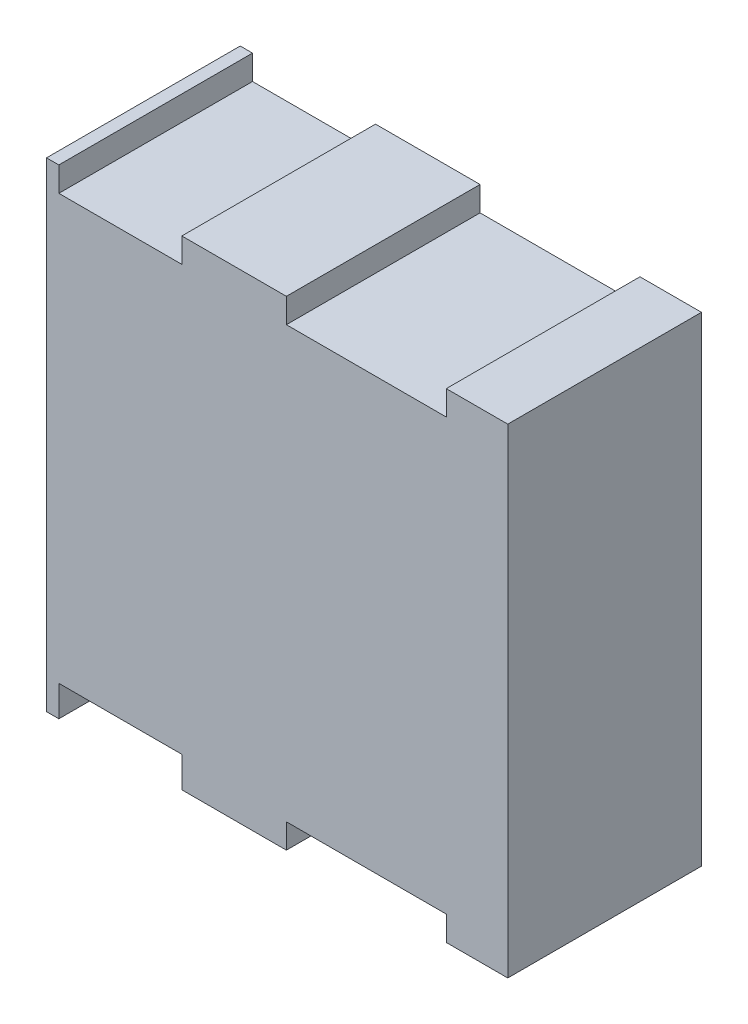
ISO-10303-21;
HEADER;
FILE_DESCRIPTION(('STEP AP214'),'2;1');
FILE_NAME('part.step','',(''),(''),'','','');
FILE_SCHEMA(('AUTOMOTIVE_DESIGN { 1 0 10303 214 1 1 1 1 }'));
ENDSEC;
DATA;
#1=APPLICATION_CONTEXT('core data for automotive mechanical design processes');
#2=APPLICATION_PROTOCOL_DEFINITION('international standard','automotive_design',2000,#1);
#3=PRODUCT_CONTEXT('',#1,'mechanical');
#4=PRODUCT('Part','Part','',(#3));
#5=PRODUCT_RELATED_PRODUCT_CATEGORY('part','',(#4));
#6=PRODUCT_DEFINITION_FORMATION('','',#4);
#7=PRODUCT_DEFINITION_CONTEXT('part definition',#1,'design');
#8=PRODUCT_DEFINITION('design','',#6,#7);
#9=PRODUCT_DEFINITION_SHAPE('','',#8);
#10=(LENGTH_UNIT() NAMED_UNIT(*) SI_UNIT(.MILLI.,.METRE.));
#11=(NAMED_UNIT(*) PLANE_ANGLE_UNIT() SI_UNIT($,.RADIAN.));
#12=(NAMED_UNIT(*) SI_UNIT($,.STERADIAN.) SOLID_ANGLE_UNIT());
#13=UNCERTAINTY_MEASURE_WITH_UNIT(LENGTH_MEASURE(1.E-05),#10,'distance_accuracy_value','');
#14=(GEOMETRIC_REPRESENTATION_CONTEXT(3) GLOBAL_UNCERTAINTY_ASSIGNED_CONTEXT((#13)) GLOBAL_UNIT_ASSIGNED_CONTEXT((#10,
#11,#12)) REPRESENTATION_CONTEXT('',''));
#15=CARTESIAN_POINT('',(0.,0.,0.));
#16=DIRECTION('',(0.,0.,1.));
#17=DIRECTION('',(1.,0.,0.));
#18=AXIS2_PLACEMENT_3D('',#15,#16,#17);
#19=CARTESIAN_POINT('',(-4.5085,-4.953,0.));
#20=DIRECTION('',(-1.,0.,0.));
#21=DIRECTION('',(0.,0.,1.));
#22=AXIS2_PLACEMENT_3D('',#19,#20,#21);
#23=PLANE('',#22);
#24=DIRECTION('',(0.,0.,1.));
#25=VECTOR('',#24,1.);
#26=CARTESIAN_POINT('',(-4.5085,-4.318,0.));
#27=LINE('',#26,#25);
#28=CARTESIAN_POINT('',(-4.5085,-4.318,0.));
#29=VERTEX_POINT('',#28);
#30=CARTESIAN_POINT('',(-4.5085,-4.318,4.));
#31=VERTEX_POINT('',#30);
#32=EDGE_CURVE('E202',#29,#31,#27,.T.);
#33=ORIENTED_EDGE('',*,*,#32,.T.);
#34=DIRECTION('',(0.,1.,0.));
#35=VECTOR('',#34,1.);
#36=CARTESIAN_POINT('',(-4.5085,-4.318,4.));
#37=LINE('',#36,#35);
#38=CARTESIAN_POINT('',(-4.5085,-4.953,4.));
#39=VERTEX_POINT('',#38);
#40=EDGE_CURVE('E204',#39,#31,#37,.T.);
#41=ORIENTED_EDGE('',*,*,#40,.F.);
#42=DIRECTION('',(0.,0.,1.));
#43=VECTOR('',#42,1.);
#44=CARTESIAN_POINT('',(-4.5085,-4.953,0.));
#45=LINE('',#44,#43);
#46=CARTESIAN_POINT('',(-4.5085,-4.953,0.));
#47=VERTEX_POINT('',#46);
#48=EDGE_CURVE('E198',#39,#47,#45,.F.);
#49=ORIENTED_EDGE('',*,*,#48,.T.);
#50=DIRECTION('',(0.,1.,0.));
#51=VECTOR('',#50,1.);
#52=CARTESIAN_POINT('',(-4.5085,-4.953,0.));
#53=LINE('',#52,#51);
#54=EDGE_CURVE('E20',#29,#47,#53,.F.);
#55=ORIENTED_EDGE('',*,*,#54,.F.);
#56=EDGE_LOOP('',(#33,#41,#49,#55));
#57=FACE_BOUND('',#56,.T.);
#58=ADVANCED_FACE('F17',(#57),#23,.F.);
#59=CARTESIAN_POINT('',(-1.9685,-4.318,0.));
#60=DIRECTION('',(1.,0.,0.));
#61=DIRECTION('',(0.,0.,-1.));
#62=AXIS2_PLACEMENT_3D('',#59,#60,#61);
#63=PLANE('',#62);
#64=DIRECTION('',(0.,0.,1.));
#65=VECTOR('',#64,1.);
#66=CARTESIAN_POINT('',(-1.9685,-4.953,0.));
#67=LINE('',#66,#65);
#68=CARTESIAN_POINT('',(-1.9685,-4.953,0.));
#69=VERTEX_POINT('',#68);
#70=CARTESIAN_POINT('',(-1.9685,-4.953,4.));
#71=VERTEX_POINT('',#70);
#72=EDGE_CURVE('E290',#69,#71,#67,.T.);
#73=ORIENTED_EDGE('',*,*,#72,.T.);
#74=DIRECTION('',(0.,1.,0.));
#75=VECTOR('',#74,1.);
#76=CARTESIAN_POINT('',(-1.9685,-4.318,4.));
#77=LINE('',#76,#75);
#78=CARTESIAN_POINT('',(-1.9685,-4.318,4.));
#79=VERTEX_POINT('',#78);
#80=EDGE_CURVE('E228',#79,#71,#77,.F.);
#81=ORIENTED_EDGE('',*,*,#80,.F.);
#82=DIRECTION('',(0.,0.,1.));
#83=VECTOR('',#82,1.);
#84=CARTESIAN_POINT('',(-1.9685,-4.318,0.));
#85=LINE('',#84,#83);
#86=CARTESIAN_POINT('',(-1.9685,-4.318,0.));
#87=VERTEX_POINT('',#86);
#88=EDGE_CURVE('E293',#79,#87,#85,.F.);
#89=ORIENTED_EDGE('',*,*,#88,.T.);
#90=DIRECTION('',(0.,1.,0.));
#91=VECTOR('',#90,1.);
#92=CARTESIAN_POINT('',(-1.9685,-4.318,0.));
#93=LINE('',#92,#91);
#94=EDGE_CURVE('E185',#69,#87,#93,.T.);
#95=ORIENTED_EDGE('',*,*,#94,.F.);
#96=EDGE_LOOP('',(#73,#81,#89,#95));
#97=FACE_BOUND('',#96,.T.);
#98=ADVANCED_FACE('F526',(#97),#63,.F.);
#99=CARTESIAN_POINT('',(0.1905,-4.953,0.));
#100=DIRECTION('',(-1.,0.,0.));
#101=DIRECTION('',(0.,0.,1.));
#102=AXIS2_PLACEMENT_3D('',#99,#100,#101);
#103=PLANE('',#102);
#104=DIRECTION('',(0.,0.,1.));
#105=VECTOR('',#104,1.);
#106=CARTESIAN_POINT('',(0.1905,-4.445,0.));
#107=LINE('',#106,#105);
#108=CARTESIAN_POINT('',(0.1905,-4.445,0.));
#109=VERTEX_POINT('',#108);
#110=CARTESIAN_POINT('',(0.1905,-4.445,4.));
#111=VERTEX_POINT('',#110);
#112=EDGE_CURVE('E281',#109,#111,#107,.T.);
#113=ORIENTED_EDGE('',*,*,#112,.T.);
#114=DIRECTION('',(0.,1.,0.));
#115=VECTOR('',#114,1.);
#116=CARTESIAN_POINT('',(0.1905,-4.318,4.));
#117=LINE('',#116,#115);
#118=CARTESIAN_POINT('',(0.1905,-4.953,4.));
#119=VERTEX_POINT('',#118);
#120=EDGE_CURVE('E226',#119,#111,#117,.T.);
#121=ORIENTED_EDGE('',*,*,#120,.F.);
#122=DIRECTION('',(0.,0.,1.));
#123=VECTOR('',#122,1.);
#124=CARTESIAN_POINT('',(0.1905,-4.953,0.));
#125=LINE('',#124,#123);
#126=CARTESIAN_POINT('',(0.1905,-4.953,0.));
#127=VERTEX_POINT('',#126);
#128=EDGE_CURVE('E284',#119,#127,#125,.F.);
#129=ORIENTED_EDGE('',*,*,#128,.T.);
#130=DIRECTION('',(0.,1.,0.));
#131=VECTOR('',#130,1.);
#132=CARTESIAN_POINT('',(0.1905,-4.953,0.));
#133=LINE('',#132,#131);
#134=EDGE_CURVE('E167',#109,#127,#133,.F.);
#135=ORIENTED_EDGE('',*,*,#134,.F.);
#136=EDGE_LOOP('',(#113,#121,#129,#135));
#137=FACE_BOUND('',#136,.T.);
#138=ADVANCED_FACE('F358',(#137),#103,.F.);
#139=CARTESIAN_POINT('',(3.4925,-4.445,0.));
#140=DIRECTION('',(1.,0.,0.));
#141=DIRECTION('',(0.,0.,-1.));
#142=AXIS2_PLACEMENT_3D('',#139,#140,#141);
#143=PLANE('',#142);
#144=DIRECTION('',(0.,0.,1.));
#145=VECTOR('',#144,1.);
#146=CARTESIAN_POINT('',(3.4925,-4.953,0.));
#147=LINE('',#146,#145);
#148=CARTESIAN_POINT('',(3.4925,-4.953,0.));
#149=VERTEX_POINT('',#148);
#150=CARTESIAN_POINT('',(3.4925,-4.953,4.));
#151=VERTEX_POINT('',#150);
#152=EDGE_CURVE('E160',#149,#151,#147,.T.);
#153=ORIENTED_EDGE('',*,*,#152,.T.);
#154=DIRECTION('',(0.,1.,0.));
#155=VECTOR('',#154,1.);
#156=CARTESIAN_POINT('',(3.4925,-4.318,4.));
#157=LINE('',#156,#155);
#158=CARTESIAN_POINT('',(3.4925,-4.445,4.));
#159=VERTEX_POINT('',#158);
#160=EDGE_CURVE('E224',#159,#151,#157,.F.);
#161=ORIENTED_EDGE('',*,*,#160,.F.);
#162=DIRECTION('',(0.,0.,1.));
#163=VECTOR('',#162,1.);
#164=CARTESIAN_POINT('',(3.4925,-4.445,0.));
#165=LINE('',#164,#163);
#166=CARTESIAN_POINT('',(3.4925,-4.445,0.));
#167=VERTEX_POINT('',#166);
#168=EDGE_CURVE('E163',#159,#167,#165,.F.);
#169=ORIENTED_EDGE('',*,*,#168,.T.);
#170=DIRECTION('',(0.,1.,0.));
#171=VECTOR('',#170,1.);
#172=CARTESIAN_POINT('',(3.4925,-4.445,0.));
#173=LINE('',#172,#171);
#174=EDGE_CURVE('E157',#149,#167,#173,.T.);
#175=ORIENTED_EDGE('',*,*,#174,.F.);
#176=EDGE_LOOP('',(#153,#161,#169,#175));
#177=FACE_BOUND('',#176,.T.);
#178=ADVANCED_FACE('F159',(#177),#143,.F.);
#179=CARTESIAN_POINT('',(3.4925,-4.953,0.));
#180=DIRECTION('',(0.,1.,0.));
#181=DIRECTION('',(0.,0.,1.));
#182=AXIS2_PLACEMENT_3D('',#179,#180,#181);
#183=PLANE('',#182);
#184=DIRECTION('',(0.,0.,1.));
#185=VECTOR('',#184,1.);
#186=CARTESIAN_POINT('',(4.7625,-4.953,0.));
#187=LINE('',#186,#185);
#188=CARTESIAN_POINT('',(4.7625,-4.953,0.));
#189=VERTEX_POINT('',#188);
#190=CARTESIAN_POINT('',(4.7625,-4.953,4.));
#191=VERTEX_POINT('',#190);
#192=EDGE_CURVE('E275',#189,#191,#187,.T.);
#193=ORIENTED_EDGE('',*,*,#192,.T.);
#194=DIRECTION('',(1.,0.,0.));
#195=VECTOR('',#194,1.);
#196=CARTESIAN_POINT('',(-4.5085,-4.953,4.));
#197=LINE('',#196,#195);
#198=EDGE_CURVE('E174',#151,#191,#197,.T.);
#199=ORIENTED_EDGE('',*,*,#198,.F.);
#200=ORIENTED_EDGE('',*,*,#152,.F.);
#201=DIRECTION('',(1.,0.,0.));
#202=VECTOR('',#201,1.);
#203=CARTESIAN_POINT('',(3.4925,-4.953,0.));
#204=LINE('',#203,#202);
#205=EDGE_CURVE('E172',#189,#149,#204,.F.);
#206=ORIENTED_EDGE('',*,*,#205,.F.);
#207=EDGE_LOOP('',(#193,#199,#200,#206));
#208=FACE_BOUND('',#207,.T.);
#209=ADVANCED_FACE('F171',(#208),#183,.F.);
#210=CARTESIAN_POINT('',(4.7625,4.953,0.));
#211=DIRECTION('',(0.,-1.,0.));
#212=DIRECTION('',(0.,0.,-1.));
#213=AXIS2_PLACEMENT_3D('',#210,#211,#212);
#214=PLANE('',#213);
#215=DIRECTION('',(0.,0.,-1.));
#216=VECTOR('',#215,1.);
#217=CARTESIAN_POINT('',(3.4925,4.953,0.));
#218=LINE('',#217,#216);
#219=CARTESIAN_POINT('',(3.4925,4.953,0.));
#220=VERTEX_POINT('',#219);
#221=CARTESIAN_POINT('',(3.4925,4.953,4.));
#222=VERTEX_POINT('',#221);
#223=EDGE_CURVE('E181',#220,#222,#218,.F.);
#224=ORIENTED_EDGE('',*,*,#223,.T.);
#225=DIRECTION('',(1.,0.,0.));
#226=VECTOR('',#225,1.);
#227=CARTESIAN_POINT('',(-4.5085,4.953,4.));
#228=LINE('',#227,#226);
#229=CARTESIAN_POINT('',(4.7625,4.953,4.));
#230=VERTEX_POINT('',#229);
#231=EDGE_CURVE('E221',#230,#222,#228,.F.);
#232=ORIENTED_EDGE('',*,*,#231,.F.);
#233=DIRECTION('',(0.,0.,1.));
#234=VECTOR('',#233,1.);
#235=CARTESIAN_POINT('',(4.7625,4.953,0.));
#236=LINE('',#235,#234);
#237=CARTESIAN_POINT('',(4.7625,4.953,0.));
#238=VERTEX_POINT('',#237);
#239=EDGE_CURVE('E268',#230,#238,#236,.F.);
#240=ORIENTED_EDGE('',*,*,#239,.T.);
#241=DIRECTION('',(1.,0.,0.));
#242=VECTOR('',#241,1.);
#243=CARTESIAN_POINT('',(4.7625,4.953,0.));
#244=LINE('',#243,#242);
#245=EDGE_CURVE('E151',#220,#238,#244,.T.);
#246=ORIENTED_EDGE('',*,*,#245,.F.);
#247=EDGE_LOOP('',(#224,#232,#240,#246));
#248=FACE_BOUND('',#247,.T.);
#249=ADVANCED_FACE('F245',(#248),#214,.F.);
#250=CARTESIAN_POINT('',(3.4925,4.953,0.));
#251=DIRECTION('',(1.,0.,0.));
#252=DIRECTION('',(0.,0.,-1.));
#253=AXIS2_PLACEMENT_3D('',#250,#251,#252);
#254=PLANE('',#253);
#255=DIRECTION('',(0.,0.,-1.));
#256=VECTOR('',#255,1.);
#257=CARTESIAN_POINT('',(3.4925,4.445,0.));
#258=LINE('',#257,#256);
#259=CARTESIAN_POINT('',(3.4925,4.445,0.));
#260=VERTEX_POINT('',#259);
#261=CARTESIAN_POINT('',(3.4925,4.445,4.));
#262=VERTEX_POINT('',#261);
#263=EDGE_CURVE('E251',#260,#262,#258,.F.);
#264=ORIENTED_EDGE('',*,*,#263,.T.);
#265=DIRECTION('',(0.,1.,0.));
#266=VECTOR('',#265,1.);
#267=CARTESIAN_POINT('',(3.4925,-4.318,4.));
#268=LINE('',#267,#266);
#269=EDGE_CURVE('E219',#222,#262,#268,.F.);
#270=ORIENTED_EDGE('',*,*,#269,.F.);
#271=ORIENTED_EDGE('',*,*,#223,.F.);
#272=DIRECTION('',(0.,1.,0.));
#273=VECTOR('',#272,1.);
#274=CARTESIAN_POINT('',(3.4925,4.953,0.));
#275=LINE('',#274,#273);
#276=EDGE_CURVE('E242',#260,#220,#275,.T.);
#277=ORIENTED_EDGE('',*,*,#276,.F.);
#278=EDGE_LOOP('',(#264,#270,#271,#277));
#279=FACE_BOUND('',#278,.T.);
#280=ADVANCED_FACE('F249',(#279),#254,.F.);
#281=CARTESIAN_POINT('',(0.1905,4.445,0.));
#282=DIRECTION('',(-1.,0.,0.));
#283=DIRECTION('',(0.,0.,1.));
#284=AXIS2_PLACEMENT_3D('',#281,#282,#283);
#285=PLANE('',#284);
#286=DIRECTION('',(0.,0.,-1.));
#287=VECTOR('',#286,1.);
#288=CARTESIAN_POINT('',(0.1905,4.953,0.));
#289=LINE('',#288,#287);
#290=CARTESIAN_POINT('',(0.1905,4.953,0.));
#291=VERTEX_POINT('',#290);
#292=CARTESIAN_POINT('',(0.1905,4.953,4.));
#293=VERTEX_POINT('',#292);
#294=EDGE_CURVE('E266',#291,#293,#289,.F.);
#295=ORIENTED_EDGE('',*,*,#294,.T.);
#296=DIRECTION('',(0.,1.,0.));
#297=VECTOR('',#296,1.);
#298=CARTESIAN_POINT('',(0.1905,-4.318,4.));
#299=LINE('',#298,#297);
#300=CARTESIAN_POINT('',(0.1905,4.445,4.));
#301=VERTEX_POINT('',#300);
#302=EDGE_CURVE('E217',#301,#293,#299,.T.);
#303=ORIENTED_EDGE('',*,*,#302,.F.);
#304=DIRECTION('',(0.,0.,-1.));
#305=VECTOR('',#304,1.);
#306=CARTESIAN_POINT('',(0.1905,4.445,0.));
#307=LINE('',#306,#305);
#308=CARTESIAN_POINT('',(0.1905,4.445,0.));
#309=VERTEX_POINT('',#308);
#310=EDGE_CURVE('E264',#301,#309,#307,.T.);
#311=ORIENTED_EDGE('',*,*,#310,.T.);
#312=DIRECTION('',(0.,1.,0.));
#313=VECTOR('',#312,1.);
#314=CARTESIAN_POINT('',(0.1905,4.445,0.));
#315=LINE('',#314,#313);
#316=EDGE_CURVE('E240',#291,#309,#315,.F.);
#317=ORIENTED_EDGE('',*,*,#316,.F.);
#318=EDGE_LOOP('',(#295,#303,#311,#317));
#319=FACE_BOUND('',#318,.T.);
#320=ADVANCED_FACE('F334',(#319),#285,.F.);
#321=CARTESIAN_POINT('',(-1.9685,4.953,0.));
#322=DIRECTION('',(1.,0.,0.));
#323=DIRECTION('',(0.,0.,-1.));
#324=AXIS2_PLACEMENT_3D('',#321,#322,#323);
#325=PLANE('',#324);
#326=DIRECTION('',(0.,0.,-1.));
#327=VECTOR('',#326,1.);
#328=CARTESIAN_POINT('',(-1.9685,4.445,0.));
#329=LINE('',#328,#327);
#330=CARTESIAN_POINT('',(-1.9685,4.445,0.));
#331=VERTEX_POINT('',#330);
#332=CARTESIAN_POINT('',(-1.9685,4.445,4.));
#333=VERTEX_POINT('',#332);
#334=EDGE_CURVE('E323',#331,#333,#329,.F.);
#335=ORIENTED_EDGE('',*,*,#334,.T.);
#336=DIRECTION('',(0.,1.,0.));
#337=VECTOR('',#336,1.);
#338=CARTESIAN_POINT('',(-1.9685,-4.318,4.));
#339=LINE('',#338,#337);
#340=CARTESIAN_POINT('',(-1.9685,4.953,4.));
#341=VERTEX_POINT('',#340);
#342=EDGE_CURVE('E215',#341,#333,#339,.F.);
#343=ORIENTED_EDGE('',*,*,#342,.F.);
#344=DIRECTION('',(0.,0.,-1.));
#345=VECTOR('',#344,1.);
#346=CARTESIAN_POINT('',(-1.9685,4.953,0.));
#347=LINE('',#346,#345);
#348=CARTESIAN_POINT('',(-1.9685,4.953,0.));
#349=VERTEX_POINT('',#348);
#350=EDGE_CURVE('E326',#341,#349,#347,.T.);
#351=ORIENTED_EDGE('',*,*,#350,.T.);
#352=DIRECTION('',(0.,1.,0.));
#353=VECTOR('',#352,1.);
#354=CARTESIAN_POINT('',(-1.9685,4.953,0.));
#355=LINE('',#354,#353);
#356=EDGE_CURVE('E238',#331,#349,#355,.T.);
#357=ORIENTED_EDGE('',*,*,#356,.F.);
#358=EDGE_LOOP('',(#335,#343,#351,#357));
#359=FACE_BOUND('',#358,.T.);
#360=ADVANCED_FACE('F474',(#359),#325,.F.);
#361=CARTESIAN_POINT('',(-4.5085,4.445,0.));
#362=DIRECTION('',(-1.,0.,0.));
#363=DIRECTION('',(0.,0.,1.));
#364=AXIS2_PLACEMENT_3D('',#361,#362,#363);
#365=PLANE('',#364);
#366=DIRECTION('',(0.,0.,-1.));
#367=VECTOR('',#366,1.);
#368=CARTESIAN_POINT('',(-4.5085,4.953,0.));
#369=LINE('',#368,#367);
#370=CARTESIAN_POINT('',(-4.5085,4.953,0.));
#371=VERTEX_POINT('',#370);
#372=CARTESIAN_POINT('',(-4.5085,4.953,4.));
#373=VERTEX_POINT('',#372);
#374=EDGE_CURVE('E233',#371,#373,#369,.F.);
#375=ORIENTED_EDGE('',*,*,#374,.T.);
#376=DIRECTION('',(0.,1.,0.));
#377=VECTOR('',#376,1.);
#378=CARTESIAN_POINT('',(-4.5085,-4.318,4.));
#379=LINE('',#378,#377);
#380=CARTESIAN_POINT('',(-4.5085,4.445,4.));
#381=VERTEX_POINT('',#380);
#382=EDGE_CURVE('E213',#381,#373,#379,.T.);
#383=ORIENTED_EDGE('',*,*,#382,.F.);
#384=DIRECTION('',(0.,0.,-1.));
#385=VECTOR('',#384,1.);
#386=CARTESIAN_POINT('',(-4.5085,4.445,0.));
#387=LINE('',#386,#385);
#388=CARTESIAN_POINT('',(-4.5085,4.445,0.));
#389=VERTEX_POINT('',#388);
#390=EDGE_CURVE('E317',#381,#389,#387,.T.);
#391=ORIENTED_EDGE('',*,*,#390,.T.);
#392=DIRECTION('',(0.,1.,0.));
#393=VECTOR('',#392,1.);
#394=CARTESIAN_POINT('',(-4.5085,4.445,0.));
#395=LINE('',#394,#393);
#396=EDGE_CURVE('E236',#371,#389,#395,.F.);
#397=ORIENTED_EDGE('',*,*,#396,.F.);
#398=EDGE_LOOP('',(#375,#383,#391,#397));
#399=FACE_BOUND('',#398,.T.);
#400=ADVANCED_FACE('F465',(#399),#365,.F.);
#401=CARTESIAN_POINT('',(-4.5085,4.953,0.));
#402=DIRECTION('',(0.,-1.,0.));
#403=DIRECTION('',(0.,0.,-1.));
#404=AXIS2_PLACEMENT_3D('',#401,#402,#403);
#405=PLANE('',#404);
#406=DIRECTION('',(0.,0.,-1.));
#407=VECTOR('',#406,1.);
#408=CARTESIAN_POINT('',(-4.7625,4.953,0.));
#409=LINE('',#408,#407);
#410=CARTESIAN_POINT('',(-4.7625,4.953,0.));
#411=VERTEX_POINT('',#410);
#412=CARTESIAN_POINT('',(-4.7625,4.953,4.));
#413=VERTEX_POINT('',#412);
#414=EDGE_CURVE('E312',#411,#413,#409,.F.);
#415=ORIENTED_EDGE('',*,*,#414,.T.);
#416=DIRECTION('',(1.,0.,0.));
#417=VECTOR('',#416,1.);
#418=CARTESIAN_POINT('',(-4.5085,4.953,4.));
#419=LINE('',#418,#417);
#420=EDGE_CURVE('E211',#373,#413,#419,.F.);
#421=ORIENTED_EDGE('',*,*,#420,.F.);
#422=ORIENTED_EDGE('',*,*,#374,.F.);
#423=DIRECTION('',(1.,0.,0.));
#424=VECTOR('',#423,1.);
#425=CARTESIAN_POINT('',(-4.5085,4.953,0.));
#426=LINE('',#425,#424);
#427=EDGE_CURVE('E230',#411,#371,#426,.T.);
#428=ORIENTED_EDGE('',*,*,#427,.F.);
#429=EDGE_LOOP('',(#415,#421,#422,#428));
#430=FACE_BOUND('',#429,.T.);
#431=ADVANCED_FACE('F457',(#430),#405,.F.);
#432=CARTESIAN_POINT('',(-4.5085,-4.318,4.));
#433=DIRECTION('',(0.,0.,1.));
#434=DIRECTION('',(1.,0.,0.));
#435=AXIS2_PLACEMENT_3D('',#432,#433,#434);
#436=PLANE('',#435);
#437=DIRECTION('',(1.,0.,0.));
#438=VECTOR('',#437,1.);
#439=CARTESIAN_POINT('',(-4.7625,-4.953,4.));
#440=LINE('',#439,#438);
#441=CARTESIAN_POINT('',(-4.7625,-4.953,4.));
#442=VERTEX_POINT('',#441);
#443=EDGE_CURVE('E205',#442,#39,#440,.T.);
#444=ORIENTED_EDGE('',*,*,#443,.T.);
#445=ORIENTED_EDGE('',*,*,#40,.T.);
#446=DIRECTION('',(1.,0.,0.));
#447=VECTOR('',#446,1.);
#448=CARTESIAN_POINT('',(-4.5085,-4.318,4.));
#449=LINE('',#448,#447);
#450=EDGE_CURVE('E295',#31,#79,#449,.T.);
#451=ORIENTED_EDGE('',*,*,#450,.T.);
#452=ORIENTED_EDGE('',*,*,#80,.T.);
#453=DIRECTION('',(1.,0.,0.));
#454=VECTOR('',#453,1.);
#455=CARTESIAN_POINT('',(-1.9685,-4.953,4.));
#456=LINE('',#455,#454);
#457=EDGE_CURVE('E287',#71,#119,#456,.T.);
#458=ORIENTED_EDGE('',*,*,#457,.T.);
#459=ORIENTED_EDGE('',*,*,#120,.T.);
#460=DIRECTION('',(1.,0.,0.));
#461=VECTOR('',#460,1.);
#462=CARTESIAN_POINT('',(0.1905,-4.445,4.));
#463=LINE('',#462,#461);
#464=EDGE_CURVE('E278',#111,#159,#463,.T.);
#465=ORIENTED_EDGE('',*,*,#464,.T.);
#466=ORIENTED_EDGE('',*,*,#160,.T.);
#467=ORIENTED_EDGE('',*,*,#198,.T.);
#468=DIRECTION('',(0.,1.,0.));
#469=VECTOR('',#468,1.);
#470=CARTESIAN_POINT('',(4.7625,-4.953,4.));
#471=LINE('',#470,#469);
#472=EDGE_CURVE('E273',#191,#230,#471,.T.);
#473=ORIENTED_EDGE('',*,*,#472,.T.);
#474=ORIENTED_EDGE('',*,*,#231,.T.);
#475=ORIENTED_EDGE('',*,*,#269,.T.);
#476=DIRECTION('',(1.,0.,0.));
#477=VECTOR('',#476,1.);
#478=CARTESIAN_POINT('',(3.4925,4.445,4.));
#479=LINE('',#478,#477);
#480=EDGE_CURVE('E256',#262,#301,#479,.F.);
#481=ORIENTED_EDGE('',*,*,#480,.T.);
#482=ORIENTED_EDGE('',*,*,#302,.T.);
#483=DIRECTION('',(1.,0.,0.));
#484=VECTOR('',#483,1.);
#485=CARTESIAN_POINT('',(0.1905,4.953,4.));
#486=LINE('',#485,#484);
#487=EDGE_CURVE('E329',#293,#341,#486,.F.);
#488=ORIENTED_EDGE('',*,*,#487,.T.);
#489=ORIENTED_EDGE('',*,*,#342,.T.);
#490=DIRECTION('',(1.,0.,0.));
#491=VECTOR('',#490,1.);
#492=CARTESIAN_POINT('',(-1.9685,4.445,4.));
#493=LINE('',#492,#491);
#494=EDGE_CURVE('E320',#333,#381,#493,.F.);
#495=ORIENTED_EDGE('',*,*,#494,.T.);
#496=ORIENTED_EDGE('',*,*,#382,.T.);
#497=ORIENTED_EDGE('',*,*,#420,.T.);
#498=DIRECTION('',(0.,1.,0.));
#499=VECTOR('',#498,1.);
#500=CARTESIAN_POINT('',(-4.7625,4.953,4.));
#501=LINE('',#500,#499);
#502=EDGE_CURVE('E304',#413,#442,#501,.F.);
#503=ORIENTED_EDGE('',*,*,#502,.T.);
#504=EDGE_LOOP('',(#444,#445,#451,#452,#458,#459,#465,#466,#467,#473,#474,#475,#481,#482,#488,
#489,#495,#496,#497,#503));
#505=FACE_BOUND('',#504,.T.);
#506=ADVANCED_FACE('F255',(#505),#436,.T.);
#507=CARTESIAN_POINT('',(-4.7625,-4.953,0.));
#508=DIRECTION('',(0.,1.,0.));
#509=DIRECTION('',(0.,0.,1.));
#510=AXIS2_PLACEMENT_3D('',#507,#508,#509);
#511=PLANE('',#510);
#512=ORIENTED_EDGE('',*,*,#48,.F.);
#513=ORIENTED_EDGE('',*,*,#443,.F.);
#514=DIRECTION('',(0.,0.,-1.));
#515=VECTOR('',#514,1.);
#516=CARTESIAN_POINT('',(-4.7625,-4.953,0.));
#517=LINE('',#516,#515);
#518=CARTESIAN_POINT('',(-4.7625,-4.953,0.));
#519=VERTEX_POINT('',#518);
#520=EDGE_CURVE('E201',#442,#519,#517,.T.);
#521=ORIENTED_EDGE('',*,*,#520,.T.);
#522=DIRECTION('',(1.,0.,0.));
#523=VECTOR('',#522,1.);
#524=CARTESIAN_POINT('',(-4.7625,-4.953,0.));
#525=LINE('',#524,#523);
#526=EDGE_CURVE('E35',#47,#519,#525,.F.);
#527=ORIENTED_EDGE('',*,*,#526,.F.);
#528=EDGE_LOOP('',(#512,#513,#521,#527));
#529=FACE_BOUND('',#528,.T.);
#530=ADVANCED_FACE('F197',(#529),#511,.F.);
#531=CARTESIAN_POINT('',(-4.5085,-4.318,0.));
#532=DIRECTION('',(0.,1.,0.));
#533=DIRECTION('',(0.,0.,1.));
#534=AXIS2_PLACEMENT_3D('',#531,#532,#533);
#535=PLANE('',#534);
#536=ORIENTED_EDGE('',*,*,#88,.F.);
#537=ORIENTED_EDGE('',*,*,#450,.F.);
#538=ORIENTED_EDGE('',*,*,#32,.F.);
#539=DIRECTION('',(1.,0.,0.));
#540=VECTOR('',#539,1.);
#541=CARTESIAN_POINT('',(-4.5085,-4.318,0.));
#542=LINE('',#541,#540);
#543=EDGE_CURVE('E190',#29,#87,#542,.T.);
#544=ORIENTED_EDGE('',*,*,#543,.T.);
#545=EDGE_LOOP('',(#536,#537,#538,#544));
#546=FACE_BOUND('',#545,.T.);
#547=ADVANCED_FACE('F300',(#546),#535,.F.);
#548=CARTESIAN_POINT('',(-1.9685,-4.953,0.));
#549=DIRECTION('',(0.,1.,0.));
#550=DIRECTION('',(0.,0.,1.));
#551=AXIS2_PLACEMENT_3D('',#548,#549,#550);
#552=PLANE('',#551);
#553=ORIENTED_EDGE('',*,*,#128,.F.);
#554=ORIENTED_EDGE('',*,*,#457,.F.);
#555=ORIENTED_EDGE('',*,*,#72,.F.);
#556=DIRECTION('',(1.,0.,0.));
#557=VECTOR('',#556,1.);
#558=CARTESIAN_POINT('',(-4.5085,-4.953,0.));
#559=LINE('',#558,#557);
#560=EDGE_CURVE('E310',#69,#127,#559,.T.);
#561=ORIENTED_EDGE('',*,*,#560,.T.);
#562=EDGE_LOOP('',(#553,#554,#555,#561));
#563=FACE_BOUND('',#562,.T.);
#564=ADVANCED_FACE('F355',(#563),#552,.F.);
#565=CARTESIAN_POINT('',(0.1905,-4.445,0.));
#566=DIRECTION('',(0.,1.,0.));
#567=DIRECTION('',(0.,0.,1.));
#568=AXIS2_PLACEMENT_3D('',#565,#566,#567);
#569=PLANE('',#568);
#570=ORIENTED_EDGE('',*,*,#168,.F.);
#571=ORIENTED_EDGE('',*,*,#464,.F.);
#572=ORIENTED_EDGE('',*,*,#112,.F.);
#573=DIRECTION('',(1.,0.,0.));
#574=VECTOR('',#573,1.);
#575=CARTESIAN_POINT('',(-4.5085,-4.445,0.));
#576=LINE('',#575,#574);
#577=EDGE_CURVE('E350',#109,#167,#576,.T.);
#578=ORIENTED_EDGE('',*,*,#577,.T.);
#579=EDGE_LOOP('',(#570,#571,#572,#578));
#580=FACE_BOUND('',#579,.T.);
#581=ADVANCED_FACE('F361',(#580),#569,.F.);
#582=CARTESIAN_POINT('',(4.7625,-4.953,0.));
#583=DIRECTION('',(-1.,0.,0.));
#584=DIRECTION('',(0.,0.,1.));
#585=AXIS2_PLACEMENT_3D('',#582,#583,#584);
#586=PLANE('',#585);
#587=ORIENTED_EDGE('',*,*,#239,.F.);
#588=ORIENTED_EDGE('',*,*,#472,.F.);
#589=ORIENTED_EDGE('',*,*,#192,.F.);
#590=DIRECTION('',(0.,1.,0.));
#591=VECTOR('',#590,1.);
#592=CARTESIAN_POINT('',(4.7625,-4.318,0.));
#593=LINE('',#592,#591);
#594=EDGE_CURVE('E179',#189,#238,#593,.T.);
#595=ORIENTED_EDGE('',*,*,#594,.T.);
#596=EDGE_LOOP('',(#587,#588,#589,#595));
#597=FACE_BOUND('',#596,.T.);
#598=ADVANCED_FACE('F363',(#597),#586,.F.);
#599=CARTESIAN_POINT('',(3.4925,4.445,0.));
#600=DIRECTION('',(0.,-1.,0.));
#601=DIRECTION('',(0.,0.,-1.));
#602=AXIS2_PLACEMENT_3D('',#599,#600,#601);
#603=PLANE('',#602);
#604=ORIENTED_EDGE('',*,*,#310,.F.);
#605=ORIENTED_EDGE('',*,*,#480,.F.);
#606=ORIENTED_EDGE('',*,*,#263,.F.);
#607=DIRECTION('',(1.,0.,0.));
#608=VECTOR('',#607,1.);
#609=CARTESIAN_POINT('',(-4.5085,4.445,0.));
#610=LINE('',#609,#608);
#611=EDGE_CURVE('E343',#260,#309,#610,.F.);
#612=ORIENTED_EDGE('',*,*,#611,.T.);
#613=EDGE_LOOP('',(#604,#605,#606,#612));
#614=FACE_BOUND('',#613,.T.);
#615=ADVANCED_FACE('F260',(#614),#603,.F.);
#616=CARTESIAN_POINT('',(0.1905,4.953,0.));
#617=DIRECTION('',(0.,-1.,0.));
#618=DIRECTION('',(0.,0.,-1.));
#619=AXIS2_PLACEMENT_3D('',#616,#617,#618);
#620=PLANE('',#619);
#621=ORIENTED_EDGE('',*,*,#350,.F.);
#622=ORIENTED_EDGE('',*,*,#487,.F.);
#623=ORIENTED_EDGE('',*,*,#294,.F.);
#624=DIRECTION('',(1.,0.,0.));
#625=VECTOR('',#624,1.);
#626=CARTESIAN_POINT('',(-4.5085,4.953,0.));
#627=LINE('',#626,#625);
#628=EDGE_CURVE('E341',#291,#349,#627,.F.);
#629=ORIENTED_EDGE('',*,*,#628,.T.);
#630=EDGE_LOOP('',(#621,#622,#623,#629));
#631=FACE_BOUND('',#630,.T.);
#632=ADVANCED_FACE('F340',(#631),#620,.F.);
#633=CARTESIAN_POINT('',(-1.9685,4.445,0.));
#634=DIRECTION('',(0.,-1.,0.));
#635=DIRECTION('',(0.,0.,-1.));
#636=AXIS2_PLACEMENT_3D('',#633,#634,#635);
#637=PLANE('',#636);
#638=ORIENTED_EDGE('',*,*,#390,.F.);
#639=ORIENTED_EDGE('',*,*,#494,.F.);
#640=ORIENTED_EDGE('',*,*,#334,.F.);
#641=DIRECTION('',(1.,0.,0.));
#642=VECTOR('',#641,1.);
#643=CARTESIAN_POINT('',(-4.5085,4.445,0.));
#644=LINE('',#643,#642);
#645=EDGE_CURVE('E26',#331,#389,#644,.F.);
#646=ORIENTED_EDGE('',*,*,#645,.T.);
#647=EDGE_LOOP('',(#638,#639,#640,#646));
#648=FACE_BOUND('',#647,.T.);
#649=ADVANCED_FACE('F378',(#648),#637,.F.);
#650=CARTESIAN_POINT('',(-4.7625,4.953,0.));
#651=DIRECTION('',(1.,0.,0.));
#652=DIRECTION('',(0.,0.,-1.));
#653=AXIS2_PLACEMENT_3D('',#650,#651,#652);
#654=PLANE('',#653);
#655=ORIENTED_EDGE('',*,*,#520,.F.);
#656=ORIENTED_EDGE('',*,*,#502,.F.);
#657=ORIENTED_EDGE('',*,*,#414,.F.);
#658=DIRECTION('',(0.,1.,0.));
#659=VECTOR('',#658,1.);
#660=CARTESIAN_POINT('',(-4.7625,-4.318,0.));
#661=LINE('',#660,#659);
#662=EDGE_CURVE('E11',#411,#519,#661,.F.);
#663=ORIENTED_EDGE('',*,*,#662,.T.);
#664=EDGE_LOOP('',(#655,#656,#657,#663));
#665=FACE_BOUND('',#664,.T.);
#666=ADVANCED_FACE('F306',(#665),#654,.F.);
#667=CARTESIAN_POINT('',(-4.5085,-4.318,0.));
#668=DIRECTION('',(0.,0.,1.));
#669=DIRECTION('',(1.,0.,0.));
#670=AXIS2_PLACEMENT_3D('',#667,#668,#669);
#671=PLANE('',#670);
#672=ORIENTED_EDGE('',*,*,#526,.T.);
#673=ORIENTED_EDGE('',*,*,#662,.F.);
#674=ORIENTED_EDGE('',*,*,#427,.T.);
#675=ORIENTED_EDGE('',*,*,#396,.T.);
#676=ORIENTED_EDGE('',*,*,#645,.F.);
#677=ORIENTED_EDGE('',*,*,#356,.T.);
#678=ORIENTED_EDGE('',*,*,#628,.F.);
#679=ORIENTED_EDGE('',*,*,#316,.T.);
#680=ORIENTED_EDGE('',*,*,#611,.F.);
#681=ORIENTED_EDGE('',*,*,#276,.T.);
#682=ORIENTED_EDGE('',*,*,#245,.T.);
#683=ORIENTED_EDGE('',*,*,#594,.F.);
#684=ORIENTED_EDGE('',*,*,#205,.T.);
#685=ORIENTED_EDGE('',*,*,#174,.T.);
#686=ORIENTED_EDGE('',*,*,#577,.F.);
#687=ORIENTED_EDGE('',*,*,#134,.T.);
#688=ORIENTED_EDGE('',*,*,#560,.F.);
#689=ORIENTED_EDGE('',*,*,#94,.T.);
#690=ORIENTED_EDGE('',*,*,#543,.F.);
#691=ORIENTED_EDGE('',*,*,#54,.T.);
#692=EDGE_LOOP('',(#672,#673,#674,#675,#676,#677,#678,#679,#680,#681,#682,#683,#684,#685,#686,
#687,#688,#689,#690,#691));
#693=FACE_BOUND('',#692,.T.);
#694=ADVANCED_FACE('F177',(#693),#671,.F.);
#695=CLOSED_SHELL('',(#58,#98,#138,#178,#209,#249,#280,#320,#360,#400,#431,#506,#530,#547,#564,
#581,#598,#615,#632,#649,#666,#694));
#696=MANIFOLD_SOLID_BREP('B1',#695);
#697=ADVANCED_BREP_SHAPE_REPRESENTATION('',(#18,#696),#14);
#698=SHAPE_DEFINITION_REPRESENTATION(#9,#697);
ENDSEC;
END-ISO-10303-21;
